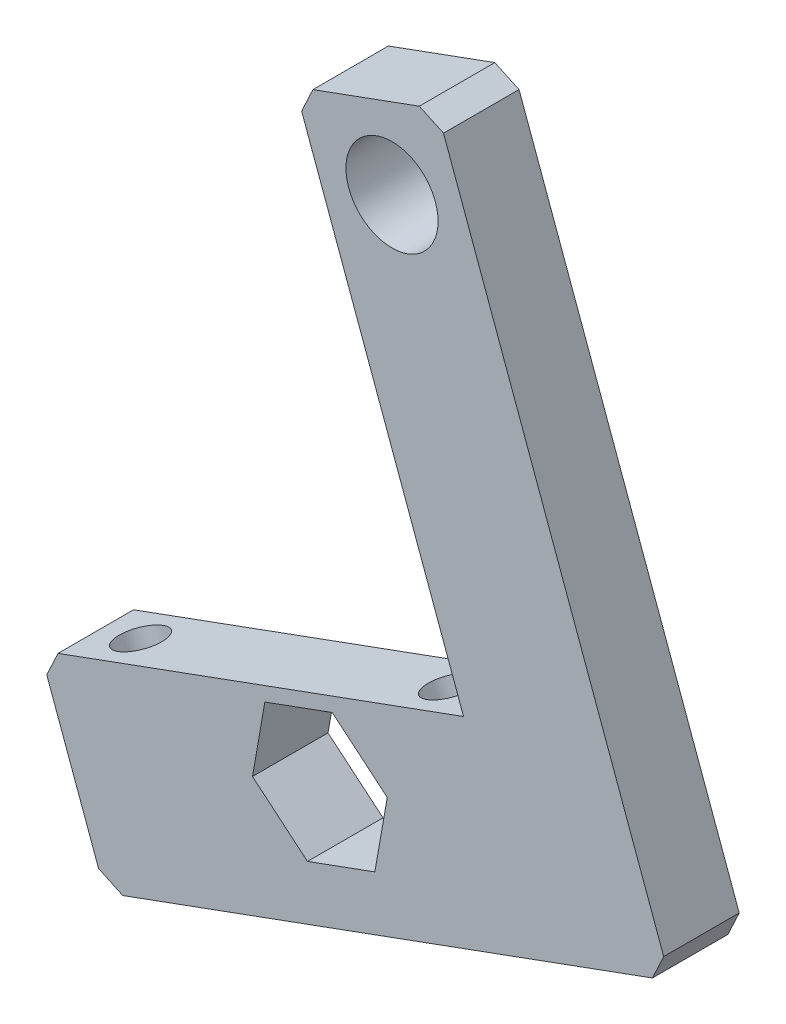
ISO-10303-21;
HEADER;
FILE_DESCRIPTION(('STEP AP214'),'2;1');
FILE_NAME('part.step','',(''),(''),'','','');
FILE_SCHEMA(('AUTOMOTIVE_DESIGN { 1 0 10303 214 1 1 1 1 }'));
ENDSEC;
DATA;
#1=APPLICATION_CONTEXT('core data for automotive mechanical design processes');
#2=APPLICATION_PROTOCOL_DEFINITION('international standard','automotive_design',2000,#1);
#3=PRODUCT_CONTEXT('',#1,'mechanical');
#4=PRODUCT('Part','Part','',(#3));
#5=PRODUCT_RELATED_PRODUCT_CATEGORY('part','',(#4));
#6=PRODUCT_DEFINITION_FORMATION('','',#4);
#7=PRODUCT_DEFINITION_CONTEXT('part definition',#1,'design');
#8=PRODUCT_DEFINITION('design','',#6,#7);
#9=PRODUCT_DEFINITION_SHAPE('','',#8);
#10=(LENGTH_UNIT() NAMED_UNIT(*) SI_UNIT(.MILLI.,.METRE.));
#11=(NAMED_UNIT(*) PLANE_ANGLE_UNIT() SI_UNIT($,.RADIAN.));
#12=(NAMED_UNIT(*) SI_UNIT($,.STERADIAN.) SOLID_ANGLE_UNIT());
#13=UNCERTAINTY_MEASURE_WITH_UNIT(LENGTH_MEASURE(1.E-05),#10,'distance_accuracy_value','');
#14=(GEOMETRIC_REPRESENTATION_CONTEXT(3) GLOBAL_UNCERTAINTY_ASSIGNED_CONTEXT((#13)) GLOBAL_UNIT_ASSIGNED_CONTEXT((#10,
#11,#12)) REPRESENTATION_CONTEXT('',''));
#15=CARTESIAN_POINT('',(0.,0.,0.));
#16=DIRECTION('',(0.,0.,1.));
#17=DIRECTION('',(1.,0.,0.));
#18=AXIS2_PLACEMENT_3D('',#15,#16,#17);
#19=CARTESIAN_POINT('',(0.,0.,10.));
#20=DIRECTION('',(0.,0.,1.));
#21=DIRECTION('',(1.,0.,0.));
#22=AXIS2_PLACEMENT_3D('',#19,#20,#21);
#23=PLANE('',#22);
#24=DIRECTION('',(0.939326399491918,0.34302465686529,0.));
#25=VECTOR('',#24,1.);
#26=CARTESIAN_POINT('',(-52.7542370921979,-69.6560730141523,10.));
#27=LINE('',#26,#25);
#28=CARTESIAN_POINT('',(-52.7542370921979,-69.6560730141523,10.));
#29=VERTEX_POINT('',#28);
#30=CARTESIAN_POINT('',(-43.8306362970247,-66.397338773932,10.));
#31=VERTEX_POINT('',#30);
#32=EDGE_CURVE('E153',#29,#31,#27,.T.);
#33=ORIENTED_EDGE('',*,*,#32,.T.);
#34=DIRECTION('',(0.76673126671573,-0.641968195972738,0.));
#35=VECTOR('',#34,1.);
#36=CARTESIAN_POINT('',(-43.8306362970247,-66.397338773932,10.));
#37=LINE('',#36,#35);
#38=CARTESIAN_POINT('',(-36.5466892632253,-72.496036635673,10.));
#39=VERTEX_POINT('',#38);
#40=EDGE_CURVE('E162',#31,#39,#37,.T.);
#41=ORIENTED_EDGE('',*,*,#40,.T.);
#42=DIRECTION('',(-0.172595132776182,-0.984992852838015,0.));
#43=VECTOR('',#42,1.);
#44=CARTESIAN_POINT('',(-36.5466892632253,-72.496036635673,10.));
#45=LINE('',#44,#43);
#46=CARTESIAN_POINT('',(-38.186343024599,-81.8534687376342,10.));
#47=VERTEX_POINT('',#46);
#48=EDGE_CURVE('E48',#39,#47,#45,.T.);
#49=ORIENTED_EDGE('',*,*,#48,.T.);
#50=DIRECTION('',(-0.939326399491919,-0.343024656865288,0.));
#51=VECTOR('',#50,1.);
#52=CARTESIAN_POINT('',(-38.186343024599,-81.8534687376342,10.));
#53=LINE('',#52,#51);
#54=CARTESIAN_POINT('',(-47.1099438197722,-85.1122029778544,10.));
#55=VERTEX_POINT('',#54);
#56=EDGE_CURVE('E176',#47,#55,#53,.T.);
#57=ORIENTED_EDGE('',*,*,#56,.T.);
#58=DIRECTION('',(-0.766731266715729,0.641968195972739,0.));
#59=VECTOR('',#58,1.);
#60=CARTESIAN_POINT('',(-54.3938908535717,-79.0135051161134,10.));
#61=LINE('',#60,#59);
#62=CARTESIAN_POINT('',(-54.3938908535717,-79.0135051161134,10.));
#63=VERTEX_POINT('',#62);
#64=EDGE_CURVE('E179',#55,#63,#61,.T.);
#65=ORIENTED_EDGE('',*,*,#64,.T.);
#66=DIRECTION('',(0.172595132776184,0.984992852838015,0.));
#67=VECTOR('',#66,1.);
#68=CARTESIAN_POINT('',(-52.7542370921979,-69.6560730141523,10.));
#69=LINE('',#68,#67);
#70=EDGE_CURVE('E159',#63,#29,#69,.T.);
#71=ORIENTED_EDGE('',*,*,#70,.T.);
#72=EDGE_LOOP('',(#33,#41,#49,#57,#65,#71));
#73=FACE_BOUND('',#72,.T.);
#74=DIRECTION('',(-0.343024656865283,0.93932639949192,0.));
#75=VECTOR('',#74,1.);
#76=CARTESIAN_POINT('',(0.916101106749709,-74.7842073815244,10.));
#77=LINE('',#76,#75);
#78=CARTESIAN_POINT('',(0.0585394645865141,-72.4358913827946,10.));
#79=VERTEX_POINT('',#78);
#80=CARTESIAN_POINT('',(-29.0985563689625,7.40685257401859,10.));
#81=VERTEX_POINT('',#80);
#82=EDGE_CURVE('E217',#79,#81,#77,.T.);
#83=ORIENTED_EDGE('',*,*,#82,.T.);
#84=DIRECTION('',(0.906759127811909,-0.421649005844656,0.));
#85=VECTOR('',#84,1.);
#86=CARTESIAN_POINT('',(-2.34147856806316,-5.03536599099546,10.));
#87=LINE('',#86,#85);
#88=CARTESIAN_POINT('',(-32.3044340098555,8.89760693058524,10.));
#89=VERTEX_POINT('',#88);
#90=EDGE_CURVE('E285',#81,#89,#87,.F.);
#91=ORIENTED_EDGE('',*,*,#90,.T.);
#92=DIRECTION('',(-0.939326399491921,-0.343024656865283,0.));
#93=VECTOR('',#92,1.);
#94=CARTESIAN_POINT('',(-29.9561180111257,9.75516857274845,10.));
#95=LINE('',#94,#93);
#96=CARTESIAN_POINT('',(-46.3943300022343,3.752237077606,10.));
#97=VERTEX_POINT('',#96);
#98=EDGE_CURVE('E220',#89,#97,#95,.T.);
#99=ORIENTED_EDGE('',*,*,#98,.T.);
#100=DIRECTION('',(0.421649005844656,0.906759127811909,0.));
#101=VECTOR('',#100,1.);
#102=CARTESIAN_POINT('',(-39.5805883644713,18.4052359912805,10.));
#103=LINE('',#102,#101);
#104=CARTESIAN_POINT('',(-47.8850843588009,0.546359436713024,10.));
#105=VERTEX_POINT('',#104);
#106=EDGE_CURVE('E283',#97,#105,#103,.F.);
#107=ORIENTED_EDGE('',*,*,#106,.T.);
#108=DIRECTION('',(0.343024656865283,-0.939326399491921,0.));
#109=VECTOR('',#108,1.);
#110=CARTESIAN_POINT('',(-48.7426460009641,2.8946754354428,10.));
#111=LINE('',#110,#109);
#112=CARTESIAN_POINT('',(-26.4460433047207,-58.1615405315321,10.));
#113=VERTEX_POINT('',#112);
#114=EDGE_CURVE('E224',#105,#113,#111,.T.);
#115=ORIENTED_EDGE('',*,*,#114,.T.);
#116=DIRECTION('',(-0.939326399491921,-0.343024656865282,0.));
#117=VECTOR('',#116,1.);
#118=CARTESIAN_POINT('',(-26.4460433047207,-58.1615405315321,10.));
#119=LINE('',#118,#117);
#120=CARTESIAN_POINT('',(-80.1419243501161,-77.7702848196076,10.));
#121=VERTEX_POINT('',#120);
#122=EDGE_CURVE('E226',#113,#121,#119,.T.);
#123=ORIENTED_EDGE('',*,*,#122,.T.);
#124=DIRECTION('',(0.421649005844652,0.906759127811911,0.));
#125=VECTOR('',#124,1.);
#126=CARTESIAN_POINT('',(-36.1594305200442,16.8143749128578,10.));
#127=LINE('',#126,#125);
#128=CARTESIAN_POINT('',(-81.6326787066827,-80.9761624605006,10.));
#129=VERTEX_POINT('',#128);
#130=EDGE_CURVE('E277',#121,#129,#127,.F.);
#131=ORIENTED_EDGE('',*,*,#130,.T.);
#132=DIRECTION('',(0.343024656865283,-0.93932639949192,0.));
#133=VECTOR('',#132,1.);
#134=CARTESIAN_POINT('',(-82.4902403488459,-78.6278464617708,10.));
#135=LINE('',#134,#133);
#136=CARTESIAN_POINT('',(-74.772185569377,-99.762690450339,10.));
#137=VERTEX_POINT('',#136);
#138=EDGE_CURVE('E229',#129,#137,#135,.T.);
#139=ORIENTED_EDGE('',*,*,#138,.T.);
#140=DIRECTION('',(-0.906759127811911,0.421649005844651,0.));
#141=VECTOR('',#140,1.);
#142=CARTESIAN_POINT('',(-51.4362656129048,-110.61404793693,10.));
#143=LINE('',#142,#141);
#144=CARTESIAN_POINT('',(-71.566307928484,-101.253444806906,10.));
#145=VERTEX_POINT('',#144);
#146=EDGE_CURVE('E279',#137,#145,#143,.F.);
#147=ORIENTED_EDGE('',*,*,#146,.T.);
#148=DIRECTION('',(0.93932639949192,0.343024656865283,0.));
#149=VECTOR('',#148,1.);
#150=CARTESIAN_POINT('',(-73.9146239272138,-102.111006449069,10.));
#151=LINE('',#150,#149);
#152=CARTESIAN_POINT('',(-1.43221489198007,-75.6417690236876,10.));
#153=VERTEX_POINT('',#152);
#154=EDGE_CURVE('E232',#145,#153,#151,.T.);
#155=ORIENTED_EDGE('',*,*,#154,.T.);
#156=DIRECTION('',(-0.421649005844653,-0.90675912781191,0.));
#157=VECTOR('',#156,1.);
#158=CARTESIAN_POINT('',(27.7428420942818,-12.9006054966183,10.));
#159=LINE('',#158,#157);
#160=EDGE_CURVE('E281',#153,#79,#159,.F.);
#161=ORIENTED_EDGE('',*,*,#160,.T.);
#162=EDGE_LOOP('',(#83,#91,#99,#107,#115,#123,#131,#139,#147,#155,#161));
#163=FACE_BOUND('',#162,.T.);
#164=CARTESIAN_POINT('',(-35.9191354373921,-3.06834199082358,10.));
#165=DIRECTION('',(0.,0.,1.));
#166=DIRECTION('',(1.,0.,0.));
#167=AXIS2_PLACEMENT_3D('',#164,#165,#166);
#168=CIRCLE('',#167,6.1);
#169=CARTESIAN_POINT('',(-29.8191354373921,-3.06834199082358,10.));
#170=VERTEX_POINT('',#169);
#171=EDGE_CURVE('E209',#170,#170,#168,.T.);
#172=ORIENTED_EDGE('',*,*,#171,.F.);
#173=EDGE_LOOP('',(#172));
#174=FACE_BOUND('',#173,.T.);
#175=ADVANCED_FACE('F33',(#73,#163,#174),#23,.T.);
#176=CARTESIAN_POINT('',(0.,0.,0.));
#177=DIRECTION('',(0.,0.,1.));
#178=DIRECTION('',(1.,0.,0.));
#179=AXIS2_PLACEMENT_3D('',#176,#177,#178);
#180=PLANE('',#179);
#181=DIRECTION('',(0.76673126671573,-0.641968195972738,0.));
#182=VECTOR('',#181,1.);
#183=CARTESIAN_POINT('',(-43.8306362970247,-66.397338773932,0.));
#184=LINE('',#183,#182);
#185=CARTESIAN_POINT('',(-43.8306362970247,-66.397338773932,0.));
#186=VERTEX_POINT('',#185);
#187=CARTESIAN_POINT('',(-36.5466892632253,-72.496036635673,0.));
#188=VERTEX_POINT('',#187);
#189=EDGE_CURVE('E183',#186,#188,#184,.T.);
#190=ORIENTED_EDGE('',*,*,#189,.F.);
#191=DIRECTION('',(0.939326399491918,0.34302465686529,0.));
#192=VECTOR('',#191,1.);
#193=CARTESIAN_POINT('',(-52.7542370921979,-69.6560730141523,0.));
#194=LINE('',#193,#192);
#195=CARTESIAN_POINT('',(-52.7542370921979,-69.6560730141523,0.));
#196=VERTEX_POINT('',#195);
#197=EDGE_CURVE('E56',#196,#186,#194,.T.);
#198=ORIENTED_EDGE('',*,*,#197,.F.);
#199=DIRECTION('',(0.172595132776184,0.984992852838015,0.));
#200=VECTOR('',#199,1.);
#201=CARTESIAN_POINT('',(-52.7542370921979,-69.6560730141523,0.));
#202=LINE('',#201,#200);
#203=CARTESIAN_POINT('',(-54.3938908535717,-79.0135051161134,0.));
#204=VERTEX_POINT('',#203);
#205=EDGE_CURVE('E169',#204,#196,#202,.T.);
#206=ORIENTED_EDGE('',*,*,#205,.F.);
#207=DIRECTION('',(-0.766731266715729,0.641968195972739,0.));
#208=VECTOR('',#207,1.);
#209=CARTESIAN_POINT('',(-54.3938908535717,-79.0135051161134,0.));
#210=LINE('',#209,#208);
#211=CARTESIAN_POINT('',(-47.1099438197722,-85.1122029778544,0.));
#212=VERTEX_POINT('',#211);
#213=EDGE_CURVE('E172',#212,#204,#210,.T.);
#214=ORIENTED_EDGE('',*,*,#213,.F.);
#215=DIRECTION('',(-0.939326399491919,-0.343024656865288,0.));
#216=VECTOR('',#215,1.);
#217=CARTESIAN_POINT('',(-38.186343024599,-81.8534687376342,0.));
#218=LINE('',#217,#216);
#219=CARTESIAN_POINT('',(-38.186343024599,-81.8534687376342,0.));
#220=VERTEX_POINT('',#219);
#221=EDGE_CURVE('E188',#220,#212,#218,.T.);
#222=ORIENTED_EDGE('',*,*,#221,.F.);
#223=DIRECTION('',(-0.172595132776182,-0.984992852838015,0.));
#224=VECTOR('',#223,1.);
#225=CARTESIAN_POINT('',(-36.5466892632253,-72.496036635673,0.));
#226=LINE('',#225,#224);
#227=EDGE_CURVE('E185',#188,#220,#226,.T.);
#228=ORIENTED_EDGE('',*,*,#227,.F.);
#229=EDGE_LOOP('',(#190,#198,#206,#214,#222,#228));
#230=FACE_BOUND('',#229,.T.);
#231=DIRECTION('',(-0.939326399491921,-0.343024656865283,0.));
#232=VECTOR('',#231,1.);
#233=CARTESIAN_POINT('',(-29.9561180111257,9.75516857274845,0.));
#234=LINE('',#233,#232);
#235=CARTESIAN_POINT('',(-32.3044340098555,8.89760693058524,0.));
#236=VERTEX_POINT('',#235);
#237=CARTESIAN_POINT('',(-46.3943300022343,3.752237077606,0.));
#238=VERTEX_POINT('',#237);
#239=EDGE_CURVE('E238',#236,#238,#234,.T.);
#240=ORIENTED_EDGE('',*,*,#239,.F.);
#241=DIRECTION('',(-0.906759127811909,0.421649005844656,0.));
#242=VECTOR('',#241,1.);
#243=CARTESIAN_POINT('',(-32.3044340098555,8.89760693058524,0.));
#244=LINE('',#243,#242);
#245=CARTESIAN_POINT('',(-29.0985563689625,7.40685257401859,0.));
#246=VERTEX_POINT('',#245);
#247=EDGE_CURVE('E270',#236,#246,#244,.F.);
#248=ORIENTED_EDGE('',*,*,#247,.T.);
#249=DIRECTION('',(-0.343024656865283,0.93932639949192,0.));
#250=VECTOR('',#249,1.);
#251=CARTESIAN_POINT('',(0.916101106749709,-74.7842073815244,0.));
#252=LINE('',#251,#250);
#253=CARTESIAN_POINT('',(0.0585394645865141,-72.4358913827946,0.));
#254=VERTEX_POINT('',#253);
#255=EDGE_CURVE('E212',#254,#246,#252,.T.);
#256=ORIENTED_EDGE('',*,*,#255,.F.);
#257=DIRECTION('',(0.421649005844653,0.90675912781191,0.));
#258=VECTOR('',#257,1.);
#259=CARTESIAN_POINT('',(0.0585394645865146,-72.4358913827946,0.));
#260=LINE('',#259,#258);
#261=CARTESIAN_POINT('',(-1.43221489198007,-75.6417690236876,0.));
#262=VERTEX_POINT('',#261);
#263=EDGE_CURVE('E266',#254,#262,#260,.F.);
#264=ORIENTED_EDGE('',*,*,#263,.T.);
#265=DIRECTION('',(0.93932639949192,0.343024656865283,0.));
#266=VECTOR('',#265,1.);
#267=CARTESIAN_POINT('',(-73.9146239272138,-102.111006449069,0.));
#268=LINE('',#267,#266);
#269=CARTESIAN_POINT('',(-71.566307928484,-101.253444806906,0.));
#270=VERTEX_POINT('',#269);
#271=EDGE_CURVE('E221',#270,#262,#268,.T.);
#272=ORIENTED_EDGE('',*,*,#271,.F.);
#273=DIRECTION('',(0.906759127811911,-0.421649005844651,0.));
#274=VECTOR('',#273,1.);
#275=CARTESIAN_POINT('',(-71.566307928484,-101.253444806906,0.));
#276=LINE('',#275,#274);
#277=CARTESIAN_POINT('',(-74.772185569377,-99.762690450339,0.));
#278=VERTEX_POINT('',#277);
#279=EDGE_CURVE('E264',#270,#278,#276,.F.);
#280=ORIENTED_EDGE('',*,*,#279,.T.);
#281=DIRECTION('',(0.343024656865283,-0.93932639949192,0.));
#282=VECTOR('',#281,1.);
#283=CARTESIAN_POINT('',(-82.4902403488459,-78.6278464617708,0.));
#284=LINE('',#283,#282);
#285=CARTESIAN_POINT('',(-81.6326787066827,-80.9761624605006,0.));
#286=VERTEX_POINT('',#285);
#287=EDGE_CURVE('E246',#286,#278,#284,.T.);
#288=ORIENTED_EDGE('',*,*,#287,.F.);
#289=DIRECTION('',(-0.421649005844652,-0.906759127811911,0.));
#290=VECTOR('',#289,1.);
#291=CARTESIAN_POINT('',(-81.6326787066827,-80.9761624605006,0.));
#292=LINE('',#291,#290);
#293=CARTESIAN_POINT('',(-80.1419243501161,-77.7702848196076,0.));
#294=VERTEX_POINT('',#293);
#295=EDGE_CURVE('E262',#286,#294,#292,.F.);
#296=ORIENTED_EDGE('',*,*,#295,.T.);
#297=DIRECTION('',(-0.939326399491921,-0.343024656865282,0.));
#298=VECTOR('',#297,1.);
#299=CARTESIAN_POINT('',(-26.4460433047207,-58.1615405315321,0.));
#300=LINE('',#299,#298);
#301=CARTESIAN_POINT('',(-26.4460433047207,-58.1615405315321,0.));
#302=VERTEX_POINT('',#301);
#303=EDGE_CURVE('E243',#302,#294,#300,.T.);
#304=ORIENTED_EDGE('',*,*,#303,.F.);
#305=DIRECTION('',(0.343024656865283,-0.939326399491921,0.));
#306=VECTOR('',#305,1.);
#307=CARTESIAN_POINT('',(-48.7426460009641,2.8946754354428,0.));
#308=LINE('',#307,#306);
#309=CARTESIAN_POINT('',(-47.8850843588009,0.546359436713024,0.));
#310=VERTEX_POINT('',#309);
#311=EDGE_CURVE('E241',#310,#302,#308,.T.);
#312=ORIENTED_EDGE('',*,*,#311,.F.);
#313=DIRECTION('',(-0.421649005844656,-0.906759127811909,0.));
#314=VECTOR('',#313,1.);
#315=CARTESIAN_POINT('',(-47.8850843588009,0.546359436713027,0.));
#316=LINE('',#315,#314);
#317=EDGE_CURVE('E268',#310,#238,#316,.F.);
#318=ORIENTED_EDGE('',*,*,#317,.T.);
#319=EDGE_LOOP('',(#240,#248,#256,#264,#272,#280,#288,#296,#304,#312,#318));
#320=FACE_BOUND('',#319,.T.);
#321=CARTESIAN_POINT('',(-35.9191354373921,-3.06834199082358,0.));
#322=DIRECTION('',(0.,0.,1.));
#323=DIRECTION('',(1.,0.,0.));
#324=AXIS2_PLACEMENT_3D('',#321,#322,#323);
#325=CIRCLE('',#324,6.1);
#326=CARTESIAN_POINT('',(-29.8191354373921,-3.06834199082358,0.));
#327=VERTEX_POINT('',#326);
#328=EDGE_CURVE('E213',#327,#327,#325,.T.);
#329=ORIENTED_EDGE('',*,*,#328,.T.);
#330=EDGE_LOOP('',(#329));
#331=FACE_BOUND('',#330,.T.);
#332=ADVANCED_FACE('F316',(#230,#320,#331),#180,.F.);
#333=CARTESIAN_POINT('',(0.916101106749709,-74.7842073815244,10.));
#334=DIRECTION('',(-0.939326399491921,-0.343024656865283,0.));
#335=DIRECTION('',(0.343024656865283,-0.939326399491921,0.));
#336=AXIS2_PLACEMENT_3D('',#333,#334,#335);
#337=PLANE('',#336);
#338=ORIENTED_EDGE('',*,*,#255,.T.);
#339=DIRECTION('',(0.,0.,1.));
#340=VECTOR('',#339,1.);
#341=CARTESIAN_POINT('',(-29.0985563689625,7.4068525740186,10.));
#342=LINE('',#341,#340);
#343=EDGE_CURVE('E275',#246,#81,#342,.T.);
#344=ORIENTED_EDGE('',*,*,#343,.T.);
#345=ORIENTED_EDGE('',*,*,#82,.F.);
#346=DIRECTION('',(0.,0.,-1.));
#347=VECTOR('',#346,1.);
#348=CARTESIAN_POINT('',(0.0585394645865141,-72.4358913827946,10.));
#349=LINE('',#348,#347);
#350=EDGE_CURVE('E272',#79,#254,#349,.T.);
#351=ORIENTED_EDGE('',*,*,#350,.T.);
#352=EDGE_LOOP('',(#338,#344,#345,#351));
#353=FACE_BOUND('',#352,.T.);
#354=ADVANCED_FACE('F325',(#353),#337,.F.);
#355=CARTESIAN_POINT('',(-29.9561180111257,9.75516857274845,10.));
#356=DIRECTION('',(0.343024656865283,-0.939326399491921,0.));
#357=DIRECTION('',(0.939326399491921,0.343024656865283,0.));
#358=AXIS2_PLACEMENT_3D('',#355,#356,#357);
#359=PLANE('',#358);
#360=ORIENTED_EDGE('',*,*,#98,.F.);
#361=DIRECTION('',(0.,0.,-1.));
#362=VECTOR('',#361,1.);
#363=CARTESIAN_POINT('',(-32.3044340098555,8.89760693058524,10.));
#364=LINE('',#363,#362);
#365=EDGE_CURVE('E259',#89,#236,#364,.T.);
#366=ORIENTED_EDGE('',*,*,#365,.T.);
#367=ORIENTED_EDGE('',*,*,#239,.T.);
#368=DIRECTION('',(0.,0.,1.));
#369=VECTOR('',#368,1.);
#370=CARTESIAN_POINT('',(-46.3943300022343,3.752237077606,10.));
#371=LINE('',#370,#369);
#372=EDGE_CURVE('E253',#238,#97,#371,.T.);
#373=ORIENTED_EDGE('',*,*,#372,.T.);
#374=EDGE_LOOP('',(#360,#366,#367,#373));
#375=FACE_BOUND('',#374,.T.);
#376=ADVANCED_FACE('F333',(#375),#359,.F.);
#377=CARTESIAN_POINT('',(-48.7426460009641,2.8946754354428,10.));
#378=DIRECTION('',(0.939326399491921,0.343024656865283,0.));
#379=DIRECTION('',(-0.343024656865283,0.939326399491921,0.));
#380=AXIS2_PLACEMENT_3D('',#377,#378,#379);
#381=PLANE('',#380);
#382=ORIENTED_EDGE('',*,*,#114,.F.);
#383=DIRECTION('',(0.,0.,-1.));
#384=VECTOR('',#383,1.);
#385=CARTESIAN_POINT('',(-47.8850843588009,0.546359436713025,10.));
#386=LINE('',#385,#384);
#387=EDGE_CURVE('E287',#105,#310,#386,.T.);
#388=ORIENTED_EDGE('',*,*,#387,.T.);
#389=ORIENTED_EDGE('',*,*,#311,.T.);
#390=DIRECTION('',(0.,0.,-1.));
#391=VECTOR('',#390,1.);
#392=CARTESIAN_POINT('',(-26.4460433047207,-58.1615405315321,10.));
#393=LINE('',#392,#391);
#394=EDGE_CURVE('E235',#113,#302,#393,.T.);
#395=ORIENTED_EDGE('',*,*,#394,.F.);
#396=EDGE_LOOP('',(#382,#388,#389,#395));
#397=FACE_BOUND('',#396,.T.);
#398=ADVANCED_FACE('F343',(#397),#381,.F.);
#399=CARTESIAN_POINT('',(-26.4460433047207,-58.1615405315321,10.));
#400=DIRECTION('',(0.343024656865282,-0.939326399491921,0.));
#401=DIRECTION('',(0.939326399491921,0.343024656865282,0.));
#402=AXIS2_PLACEMENT_3D('',#399,#400,#401);
#403=PLANE('',#402);
#404=CARTESIAN_POINT('',(-74.238248680654,-75.6143714737711,4.98215592301789));
#405=DIRECTION('',(-0.343024656865282,0.939326399491921,0.));
#406=DIRECTION('',(-0.939326399491921,-0.343024656865282,0.));
#407=AXIS2_PLACEMENT_3D('',#404,#405,#406);
#408=CIRCLE('',#407,3.00000000000001);
#409=CARTESIAN_POINT('',(-77.0562278791298,-76.643445444367,4.98215592301789));
#410=VERTEX_POINT('',#409);
#411=EDGE_CURVE('E203',#410,#410,#408,.T.);
#412=ORIENTED_EDGE('',*,*,#411,.F.);
#413=EDGE_LOOP('',(#412));
#414=FACE_BOUND('',#413,.T.);
#415=CARTESIAN_POINT('',(-33.3350475939509,-60.6772776956689,4.98215592301789));
#416=DIRECTION('',(-0.343024656865282,0.939326399491921,0.));
#417=DIRECTION('',(-0.939326399491921,-0.343024656865282,0.));
#418=AXIS2_PLACEMENT_3D('',#415,#416,#417);
#419=CIRCLE('',#418,3.);
#420=CARTESIAN_POINT('',(-36.1530267924267,-61.7063516662647,4.98215592301789));
#421=VERTEX_POINT('',#420);
#422=EDGE_CURVE('E195',#421,#421,#419,.T.);
#423=ORIENTED_EDGE('',*,*,#422,.F.);
#424=EDGE_LOOP('',(#423));
#425=FACE_BOUND('',#424,.T.);
#426=ORIENTED_EDGE('',*,*,#303,.T.);
#427=DIRECTION('',(0.,0.,1.));
#428=VECTOR('',#427,1.);
#429=CARTESIAN_POINT('',(-80.1419243501161,-77.7702848196076,10.));
#430=LINE('',#429,#428);
#431=EDGE_CURVE('E11',#294,#121,#430,.T.);
#432=ORIENTED_EDGE('',*,*,#431,.T.);
#433=ORIENTED_EDGE('',*,*,#122,.F.);
#434=ORIENTED_EDGE('',*,*,#394,.T.);
#435=EDGE_LOOP('',(#426,#432,#433,#434));
#436=FACE_BOUND('',#435,.T.);
#437=ADVANCED_FACE('F349',(#414,#425,#436),#403,.F.);
#438=CARTESIAN_POINT('',(-82.4902403488459,-78.6278464617708,10.));
#439=DIRECTION('',(0.93932639949192,0.343024656865283,0.));
#440=DIRECTION('',(-0.343024656865283,0.93932639949192,0.));
#441=AXIS2_PLACEMENT_3D('',#438,#439,#440);
#442=PLANE('',#441);
#443=ORIENTED_EDGE('',*,*,#287,.T.);
#444=DIRECTION('',(0.,0.,1.));
#445=VECTOR('',#444,1.);
#446=CARTESIAN_POINT('',(-74.772185569377,-99.762690450339,10.));
#447=LINE('',#446,#445);
#448=EDGE_CURVE('E41',#278,#137,#447,.T.);
#449=ORIENTED_EDGE('',*,*,#448,.T.);
#450=ORIENTED_EDGE('',*,*,#138,.F.);
#451=DIRECTION('',(0.,0.,-1.));
#452=VECTOR('',#451,1.);
#453=CARTESIAN_POINT('',(-81.6326787066827,-80.9761624605006,10.));
#454=LINE('',#453,#452);
#455=EDGE_CURVE('E295',#129,#286,#454,.T.);
#456=ORIENTED_EDGE('',*,*,#455,.T.);
#457=EDGE_LOOP('',(#443,#449,#450,#456));
#458=FACE_BOUND('',#457,.T.);
#459=ADVANCED_FACE('F300',(#458),#442,.F.);
#460=CARTESIAN_POINT('',(-73.9146239272138,-102.111006449069,10.));
#461=DIRECTION('',(-0.343024656865283,0.939326399491921,0.));
#462=DIRECTION('',(-0.939326399491921,-0.343024656865283,0.));
#463=AXIS2_PLACEMENT_3D('',#460,#461,#462);
#464=PLANE('',#463);
#465=CARTESIAN_POINT('',(-65.662632259022,-99.0975314610691,4.98215592301789));
#466=DIRECTION('',(-0.343024656865283,0.939326399491921,0.));
#467=DIRECTION('',(-0.939326399491921,-0.343024656865283,0.));
#468=AXIS2_PLACEMENT_3D('',#465,#466,#467);
#469=CIRCLE('',#468,3.00000000000001);
#470=CARTESIAN_POINT('',(-68.4806114574977,-100.126605431665,4.98215592301789));
#471=VERTEX_POINT('',#470);
#472=EDGE_CURVE('E216',#471,#471,#469,.T.);
#473=ORIENTED_EDGE('',*,*,#472,.T.);
#474=EDGE_LOOP('',(#473));
#475=FACE_BOUND('',#474,.T.);
#476=CARTESIAN_POINT('',(-24.7594311723189,-84.1604376829669,4.98215592301789));
#477=DIRECTION('',(-0.343024656865283,0.939326399491921,0.));
#478=DIRECTION('',(-0.939326399491921,-0.343024656865283,0.));
#479=AXIS2_PLACEMENT_3D('',#476,#477,#478);
#480=CIRCLE('',#479,3.);
#481=CARTESIAN_POINT('',(-27.5774103707946,-85.1895116535627,4.98215592301789));
#482=VERTEX_POINT('',#481);
#483=EDGE_CURVE('E206',#482,#482,#480,.T.);
#484=ORIENTED_EDGE('',*,*,#483,.T.);
#485=EDGE_LOOP('',(#484));
#486=FACE_BOUND('',#485,.T.);
#487=ORIENTED_EDGE('',*,*,#271,.T.);
#488=DIRECTION('',(0.,0.,1.));
#489=VECTOR('',#488,1.);
#490=CARTESIAN_POINT('',(-1.43221489198007,-75.6417690236876,10.));
#491=LINE('',#490,#489);
#492=EDGE_CURVE('E293',#262,#153,#491,.T.);
#493=ORIENTED_EDGE('',*,*,#492,.T.);
#494=ORIENTED_EDGE('',*,*,#154,.F.);
#495=DIRECTION('',(0.,0.,-1.));
#496=VECTOR('',#495,1.);
#497=CARTESIAN_POINT('',(-71.566307928484,-101.253444806906,10.));
#498=LINE('',#497,#496);
#499=EDGE_CURVE('E290',#145,#270,#498,.T.);
#500=ORIENTED_EDGE('',*,*,#499,.T.);
#501=EDGE_LOOP('',(#487,#493,#494,#500));
#502=FACE_BOUND('',#501,.T.);
#503=ADVANCED_FACE('F312',(#475,#486,#502),#464,.F.);
#504=CARTESIAN_POINT('',(-35.9191354373921,-3.06834199082358,10.));
#505=DIRECTION('',(0.,0.,-1.));
#506=DIRECTION('',(-1.,0.,0.));
#507=AXIS2_PLACEMENT_3D('',#504,#505,#506);
#508=CYLINDRICAL_SURFACE('',#507,6.1);
#509=ORIENTED_EDGE('',*,*,#171,.T.);
#510=EDGE_LOOP('',(#509));
#511=FACE_BOUND('',#510,.T.);
#512=ORIENTED_EDGE('',*,*,#328,.F.);
#513=EDGE_LOOP('',(#512));
#514=FACE_BOUND('',#513,.T.);
#515=ADVANCED_FACE('F369',(#511,#514),#508,.F.);
#516=CARTESIAN_POINT('',(-15.9544054248051,-108.271803928263,4.98215592301789));
#517=DIRECTION('',(-0.343024656865282,0.939326399491921,0.));
#518=DIRECTION('',(-0.939326399491921,-0.343024656865282,0.));
#519=AXIS2_PLACEMENT_3D('',#516,#517,#518);
#520=CYLINDRICAL_SURFACE('',#519,3.);
#521=ORIENTED_EDGE('',*,*,#422,.T.);
#522=EDGE_LOOP('',(#521));
#523=FACE_BOUND('',#522,.T.);
#524=ORIENTED_EDGE('',*,*,#483,.F.);
#525=EDGE_LOOP('',(#524));
#526=FACE_BOUND('',#525,.T.);
#527=ADVANCED_FACE('F377',(#523,#526),#520,.F.);
#528=CARTESIAN_POINT('',(-56.8576065115082,-123.208897706365,4.98215592301789));
#529=DIRECTION('',(-0.343024656865282,0.939326399491921,0.));
#530=DIRECTION('',(-0.939326399491921,-0.343024656865282,0.));
#531=AXIS2_PLACEMENT_3D('',#528,#529,#530);
#532=CYLINDRICAL_SURFACE('',#531,3.00000000000001);
#533=ORIENTED_EDGE('',*,*,#411,.T.);
#534=EDGE_LOOP('',(#533));
#535=FACE_BOUND('',#534,.T.);
#536=ORIENTED_EDGE('',*,*,#472,.F.);
#537=EDGE_LOOP('',(#536));
#538=FACE_BOUND('',#537,.T.);
#539=ADVANCED_FACE('F384',(#535,#538),#532,.F.);
#540=CARTESIAN_POINT('',(-32.3044340098555,8.89760693058524,10.));
#541=DIRECTION('',(-0.421649005844656,-0.906759127811909,0.));
#542=DIRECTION('',(0.,0.,-1.));
#543=AXIS2_PLACEMENT_3D('',#540,#541,#542);
#544=PLANE('',#543);
#545=ORIENTED_EDGE('',*,*,#90,.F.);
#546=ORIENTED_EDGE('',*,*,#343,.F.);
#547=ORIENTED_EDGE('',*,*,#247,.F.);
#548=ORIENTED_EDGE('',*,*,#365,.F.);
#549=EDGE_LOOP('',(#545,#546,#547,#548));
#550=FACE_BOUND('',#549,.T.);
#551=ADVANCED_FACE('F331',(#550),#544,.F.);
#552=CARTESIAN_POINT('',(-47.8850843588009,0.546359436713027,10.));
#553=DIRECTION('',(0.906759127811909,-0.421649005844656,0.));
#554=DIRECTION('',(0.,0.,-1.));
#555=AXIS2_PLACEMENT_3D('',#552,#553,#554);
#556=PLANE('',#555);
#557=ORIENTED_EDGE('',*,*,#106,.F.);
#558=ORIENTED_EDGE('',*,*,#372,.F.);
#559=ORIENTED_EDGE('',*,*,#317,.F.);
#560=ORIENTED_EDGE('',*,*,#387,.F.);
#561=EDGE_LOOP('',(#557,#558,#559,#560));
#562=FACE_BOUND('',#561,.T.);
#563=ADVANCED_FACE('F340',(#562),#556,.F.);
#564=CARTESIAN_POINT('',(0.0585394645865146,-72.4358913827946,10.));
#565=DIRECTION('',(-0.90675912781191,0.421649005844653,0.));
#566=DIRECTION('',(0.,0.,-1.));
#567=AXIS2_PLACEMENT_3D('',#564,#565,#566);
#568=PLANE('',#567);
#569=ORIENTED_EDGE('',*,*,#160,.F.);
#570=ORIENTED_EDGE('',*,*,#492,.F.);
#571=ORIENTED_EDGE('',*,*,#263,.F.);
#572=ORIENTED_EDGE('',*,*,#350,.F.);
#573=EDGE_LOOP('',(#569,#570,#571,#572));
#574=FACE_BOUND('',#573,.T.);
#575=ADVANCED_FACE('F322',(#574),#568,.F.);
#576=CARTESIAN_POINT('',(-71.566307928484,-101.253444806906,10.));
#577=DIRECTION('',(0.421649005844651,0.906759127811911,0.));
#578=DIRECTION('',(0.,0.,-1.));
#579=AXIS2_PLACEMENT_3D('',#576,#577,#578);
#580=PLANE('',#579);
#581=ORIENTED_EDGE('',*,*,#146,.F.);
#582=ORIENTED_EDGE('',*,*,#448,.F.);
#583=ORIENTED_EDGE('',*,*,#279,.F.);
#584=ORIENTED_EDGE('',*,*,#499,.F.);
#585=EDGE_LOOP('',(#581,#582,#583,#584));
#586=FACE_BOUND('',#585,.T.);
#587=ADVANCED_FACE('F309',(#586),#580,.F.);
#588=CARTESIAN_POINT('',(-81.6326787066827,-80.9761624605006,10.));
#589=DIRECTION('',(0.906759127811911,-0.421649005844652,0.));
#590=DIRECTION('',(0.,0.,-1.));
#591=AXIS2_PLACEMENT_3D('',#588,#589,#590);
#592=PLANE('',#591);
#593=ORIENTED_EDGE('',*,*,#130,.F.);
#594=ORIENTED_EDGE('',*,*,#431,.F.);
#595=ORIENTED_EDGE('',*,*,#295,.F.);
#596=ORIENTED_EDGE('',*,*,#455,.F.);
#597=EDGE_LOOP('',(#593,#594,#595,#596));
#598=FACE_BOUND('',#597,.T.);
#599=ADVANCED_FACE('F35',(#598),#592,.F.);
#600=CARTESIAN_POINT('',(-52.7542370921979,-69.6560730141523,10.));
#601=DIRECTION('',(-0.34302465686529,0.939326399491918,0.));
#602=DIRECTION('',(-0.939326399491918,-0.34302465686529,0.));
#603=AXIS2_PLACEMENT_3D('',#600,#601,#602);
#604=PLANE('',#603);
#605=ORIENTED_EDGE('',*,*,#197,.T.);
#606=DIRECTION('',(0.,0.,-1.));
#607=VECTOR('',#606,1.);
#608=CARTESIAN_POINT('',(-43.8306362970247,-66.397338773932,10.));
#609=LINE('',#608,#607);
#610=EDGE_CURVE('E149',#31,#186,#609,.T.);
#611=ORIENTED_EDGE('',*,*,#610,.F.);
#612=ORIENTED_EDGE('',*,*,#32,.F.);
#613=DIRECTION('',(0.,0.,-1.));
#614=VECTOR('',#613,1.);
#615=CARTESIAN_POINT('',(-52.7542370921979,-69.6560730141523,10.));
#616=LINE('',#615,#614);
#617=EDGE_CURVE('E193',#29,#196,#616,.T.);
#618=ORIENTED_EDGE('',*,*,#617,.T.);
#619=EDGE_LOOP('',(#605,#611,#612,#618));
#620=FACE_BOUND('',#619,.T.);
#621=ADVANCED_FACE('F151',(#620),#604,.F.);
#622=CARTESIAN_POINT('',(-52.7542370921979,-69.6560730141523,10.));
#623=DIRECTION('',(-0.984992852838015,0.172595132776184,0.));
#624=DIRECTION('',(-0.172595132776184,-0.984992852838015,0.));
#625=AXIS2_PLACEMENT_3D('',#622,#623,#624);
#626=PLANE('',#625);
#627=ORIENTED_EDGE('',*,*,#205,.T.);
#628=ORIENTED_EDGE('',*,*,#617,.F.);
#629=ORIENTED_EDGE('',*,*,#70,.F.);
#630=DIRECTION('',(0.,0.,-1.));
#631=VECTOR('',#630,1.);
#632=CARTESIAN_POINT('',(-54.3938908535717,-79.0135051161134,10.));
#633=LINE('',#632,#631);
#634=EDGE_CURVE('E196',#63,#204,#633,.T.);
#635=ORIENTED_EDGE('',*,*,#634,.T.);
#636=EDGE_LOOP('',(#627,#628,#629,#635));
#637=FACE_BOUND('',#636,.T.);
#638=ADVANCED_FACE('F394',(#637),#626,.F.);
#639=CARTESIAN_POINT('',(-54.3938908535717,-79.0135051161134,10.));
#640=DIRECTION('',(-0.641968195972739,-0.766731266715729,0.));
#641=DIRECTION('',(0.766731266715729,-0.641968195972739,0.));
#642=AXIS2_PLACEMENT_3D('',#639,#640,#641);
#643=PLANE('',#642);
#644=ORIENTED_EDGE('',*,*,#213,.T.);
#645=ORIENTED_EDGE('',*,*,#634,.F.);
#646=ORIENTED_EDGE('',*,*,#64,.F.);
#647=DIRECTION('',(0.,0.,-1.));
#648=VECTOR('',#647,1.);
#649=CARTESIAN_POINT('',(-47.1099438197722,-85.1122029778544,10.));
#650=LINE('',#649,#648);
#651=EDGE_CURVE('E198',#55,#212,#650,.T.);
#652=ORIENTED_EDGE('',*,*,#651,.T.);
#653=EDGE_LOOP('',(#644,#645,#646,#652));
#654=FACE_BOUND('',#653,.T.);
#655=ADVANCED_FACE('F403',(#654),#643,.F.);
#656=CARTESIAN_POINT('',(-38.186343024599,-81.8534687376342,10.));
#657=DIRECTION('',(0.343024656865288,-0.939326399491919,0.));
#658=DIRECTION('',(0.939326399491919,0.343024656865288,0.));
#659=AXIS2_PLACEMENT_3D('',#656,#657,#658);
#660=PLANE('',#659);
#661=ORIENTED_EDGE('',*,*,#221,.T.);
#662=ORIENTED_EDGE('',*,*,#651,.F.);
#663=ORIENTED_EDGE('',*,*,#56,.F.);
#664=DIRECTION('',(0.,0.,-1.));
#665=VECTOR('',#664,1.);
#666=CARTESIAN_POINT('',(-38.186343024599,-81.8534687376342,10.));
#667=LINE('',#666,#665);
#668=EDGE_CURVE('E200',#47,#220,#667,.T.);
#669=ORIENTED_EDGE('',*,*,#668,.T.);
#670=EDGE_LOOP('',(#661,#662,#663,#669));
#671=FACE_BOUND('',#670,.T.);
#672=ADVANCED_FACE('F400',(#671),#660,.F.);
#673=CARTESIAN_POINT('',(-36.5466892632253,-72.496036635673,10.));
#674=DIRECTION('',(0.984992852838015,-0.172595132776182,0.));
#675=DIRECTION('',(0.172595132776182,0.984992852838015,0.));
#676=AXIS2_PLACEMENT_3D('',#673,#674,#675);
#677=PLANE('',#676);
#678=ORIENTED_EDGE('',*,*,#227,.T.);
#679=ORIENTED_EDGE('',*,*,#668,.F.);
#680=ORIENTED_EDGE('',*,*,#48,.F.);
#681=DIRECTION('',(0.,0.,-1.));
#682=VECTOR('',#681,1.);
#683=CARTESIAN_POINT('',(-36.5466892632253,-72.496036635673,10.));
#684=LINE('',#683,#682);
#685=EDGE_CURVE('E158',#39,#188,#684,.T.);
#686=ORIENTED_EDGE('',*,*,#685,.T.);
#687=EDGE_LOOP('',(#678,#679,#680,#686));
#688=FACE_BOUND('',#687,.T.);
#689=ADVANCED_FACE('F397',(#688),#677,.F.);
#690=CARTESIAN_POINT('',(-43.8306362970247,-66.397338773932,10.));
#691=DIRECTION('',(0.641968195972738,0.76673126671573,0.));
#692=DIRECTION('',(-0.76673126671573,0.641968195972738,0.));
#693=AXIS2_PLACEMENT_3D('',#690,#691,#692);
#694=PLANE('',#693);
#695=ORIENTED_EDGE('',*,*,#189,.T.);
#696=ORIENTED_EDGE('',*,*,#685,.F.);
#697=ORIENTED_EDGE('',*,*,#40,.F.);
#698=ORIENTED_EDGE('',*,*,#610,.T.);
#699=EDGE_LOOP('',(#695,#696,#697,#698));
#700=FACE_BOUND('',#699,.T.);
#701=ADVANCED_FACE('F163',(#700),#694,.F.);
#702=CLOSED_SHELL('',(#175,#332,#354,#376,#398,#437,#459,#503,#515,#527,#539,#551,#563,#575,
#587,#599,#621,#638,#655,#672,#689,#701));
#703=MANIFOLD_SOLID_BREP('B2',#702);
#704=ADVANCED_BREP_SHAPE_REPRESENTATION('',(#18,#703),#14);
#705=SHAPE_DEFINITION_REPRESENTATION(#9,#704);
ENDSEC;
END-ISO-10303-21;
